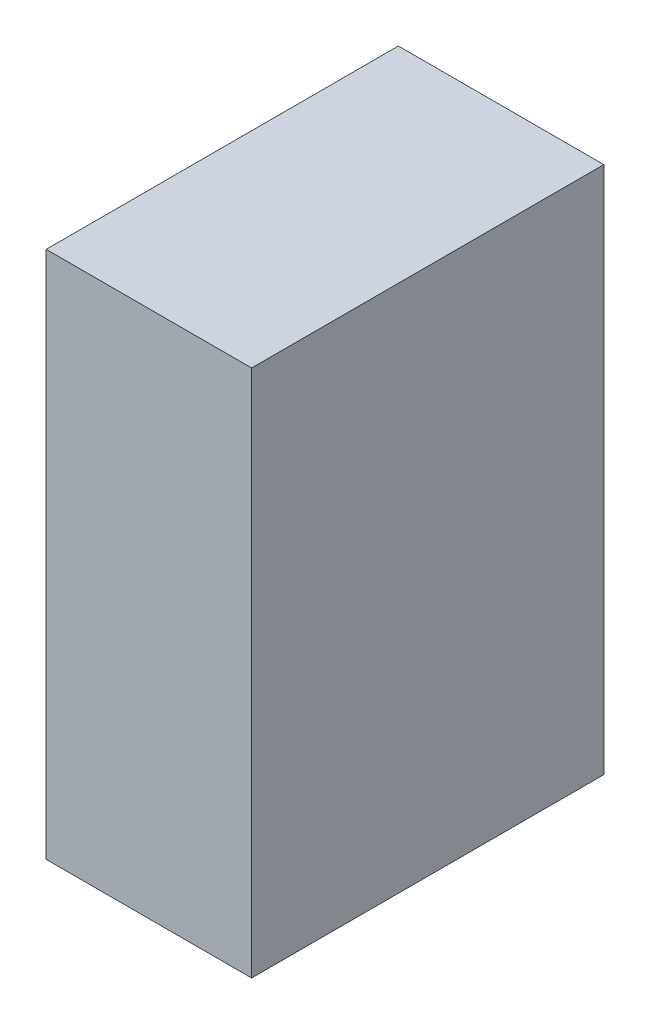
ISO-10303-21;
HEADER;
FILE_DESCRIPTION(('STEP AP214'),'2;1');
FILE_NAME('part.step','',(''),(''),'','','');
FILE_SCHEMA(('AUTOMOTIVE_DESIGN { 1 0 10303 214 1 1 1 1 }'));
ENDSEC;
DATA;
#1=APPLICATION_CONTEXT('core data for automotive mechanical design processes');
#2=APPLICATION_PROTOCOL_DEFINITION('international standard','automotive_design',2000,#1);
#3=PRODUCT_CONTEXT('',#1,'mechanical');
#4=PRODUCT('Part','Part','',(#3));
#5=PRODUCT_RELATED_PRODUCT_CATEGORY('part','',(#4));
#6=PRODUCT_DEFINITION_FORMATION('','',#4);
#7=PRODUCT_DEFINITION_CONTEXT('part definition',#1,'design');
#8=PRODUCT_DEFINITION('design','',#6,#7);
#9=PRODUCT_DEFINITION_SHAPE('','',#8);
#10=(LENGTH_UNIT() NAMED_UNIT(*) SI_UNIT(.MILLI.,.METRE.));
#11=(NAMED_UNIT(*) PLANE_ANGLE_UNIT() SI_UNIT($,.RADIAN.));
#12=(NAMED_UNIT(*) SI_UNIT($,.STERADIAN.) SOLID_ANGLE_UNIT());
#13=UNCERTAINTY_MEASURE_WITH_UNIT(LENGTH_MEASURE(1.E-05),#10,'distance_accuracy_value','');
#14=(GEOMETRIC_REPRESENTATION_CONTEXT(3) GLOBAL_UNCERTAINTY_ASSIGNED_CONTEXT((#13)) GLOBAL_UNIT_ASSIGNED_CONTEXT((#10,
#11,#12)) REPRESENTATION_CONTEXT('',''));
#15=CARTESIAN_POINT('',(0.,0.,0.));
#16=DIRECTION('',(0.,0.,1.));
#17=DIRECTION('',(1.,0.,0.));
#18=AXIS2_PLACEMENT_3D('',#15,#16,#17);
#19=CARTESIAN_POINT('',(-0.17500092,0.4499991,0.5999988));
#20=DIRECTION('',(0.,0.,-1.));
#21=DIRECTION('',(0.,-1.,0.));
#22=AXIS2_PLACEMENT_3D('',#19,#20,#21);
#23=PLANE('',#22);
#24=DIRECTION('',(0.,-1.,0.));
#25=VECTOR('',#24,1.);
#26=CARTESIAN_POINT('',(-0.17500092,0.4499991,0.5999988));
#27=LINE('',#26,#25);
#28=CARTESIAN_POINT('',(-0.17500092,0.4499991,0.5999988));
#29=VERTEX_POINT('',#28);
#30=CARTESIAN_POINT('',(-0.17500092,-0.4499991,0.5999988));
#31=VERTEX_POINT('',#30);
#32=EDGE_CURVE('E82',#29,#31,#27,.T.);
#33=ORIENTED_EDGE('',*,*,#32,.T.);
#34=DIRECTION('',(1.,0.,0.));
#35=VECTOR('',#34,1.);
#36=CARTESIAN_POINT('',(-0.17500092,-0.4499991,0.5999988));
#37=LINE('',#36,#35);
#38=CARTESIAN_POINT('',(0.17499838,-0.4499991,0.5999988));
#39=VERTEX_POINT('',#38);
#40=EDGE_CURVE('E100',#31,#39,#37,.T.);
#41=ORIENTED_EDGE('',*,*,#40,.T.);
#42=DIRECTION('',(0.,1.,0.));
#43=VECTOR('',#42,1.);
#44=CARTESIAN_POINT('',(0.17499838,-0.4499991,0.5999988));
#45=LINE('',#44,#43);
#46=CARTESIAN_POINT('',(0.17499838,0.4499991,0.5999988));
#47=VERTEX_POINT('',#46);
#48=EDGE_CURVE('E74',#39,#47,#45,.T.);
#49=ORIENTED_EDGE('',*,*,#48,.T.);
#50=DIRECTION('',(-1.,0.,0.));
#51=VECTOR('',#50,1.);
#52=CARTESIAN_POINT('',(0.17499838,0.4499991,0.5999988));
#53=LINE('',#52,#51);
#54=EDGE_CURVE('E11',#47,#29,#53,.T.);
#55=ORIENTED_EDGE('',*,*,#54,.T.);
#56=EDGE_LOOP('',(#33,#41,#49,#55));
#57=FACE_BOUND('',#56,.T.);
#58=ADVANCED_FACE('F17',(#57),#23,.F.);
#59=CARTESIAN_POINT('',(-0.17500092,0.4499991,0.));
#60=DIRECTION('',(0.,0.,-1.));
#61=DIRECTION('',(0.,-1.,0.));
#62=AXIS2_PLACEMENT_3D('',#59,#60,#61);
#63=PLANE('',#62);
#64=DIRECTION('',(-1.,0.,0.));
#65=VECTOR('',#64,1.);
#66=CARTESIAN_POINT('',(0.17499838,0.4499991,0.));
#67=LINE('',#66,#65);
#68=CARTESIAN_POINT('',(0.17499838,0.4499991,0.));
#69=VERTEX_POINT('',#68);
#70=CARTESIAN_POINT('',(-0.17500092,0.4499991,0.));
#71=VERTEX_POINT('',#70);
#72=EDGE_CURVE('E26',#69,#71,#67,.T.);
#73=ORIENTED_EDGE('',*,*,#72,.F.);
#74=DIRECTION('',(0.,1.,0.));
#75=VECTOR('',#74,1.);
#76=CARTESIAN_POINT('',(0.17499838,-0.4499991,0.));
#77=LINE('',#76,#75);
#78=CARTESIAN_POINT('',(0.17499838,-0.4499991,0.));
#79=VERTEX_POINT('',#78);
#80=EDGE_CURVE('E20',#79,#69,#77,.T.);
#81=ORIENTED_EDGE('',*,*,#80,.F.);
#82=DIRECTION('',(1.,0.,0.));
#83=VECTOR('',#82,1.);
#84=CARTESIAN_POINT('',(-0.17500092,-0.4499991,0.));
#85=LINE('',#84,#83);
#86=CARTESIAN_POINT('',(-0.17500092,-0.4499991,0.));
#87=VERTEX_POINT('',#86);
#88=EDGE_CURVE('E84',#87,#79,#85,.T.);
#89=ORIENTED_EDGE('',*,*,#88,.F.);
#90=DIRECTION('',(0.,-1.,0.));
#91=VECTOR('',#90,1.);
#92=CARTESIAN_POINT('',(-0.17500092,0.4499991,0.));
#93=LINE('',#92,#91);
#94=EDGE_CURVE('E80',#71,#87,#93,.T.);
#95=ORIENTED_EDGE('',*,*,#94,.F.);
#96=EDGE_LOOP('',(#73,#81,#89,#95));
#97=FACE_BOUND('',#96,.T.);
#98=ADVANCED_FACE('F85',(#97),#63,.T.);
#99=CARTESIAN_POINT('',(0.17499838,0.4499991,0.));
#100=DIRECTION('',(0.,-1.,0.));
#101=DIRECTION('',(0.,0.,-1.));
#102=AXIS2_PLACEMENT_3D('',#99,#100,#101);
#103=PLANE('',#102);
#104=ORIENTED_EDGE('',*,*,#72,.T.);
#105=DIRECTION('',(0.,0.,1.));
#106=VECTOR('',#105,1.);
#107=CARTESIAN_POINT('',(-0.17500092,0.4499991,0.));
#108=LINE('',#107,#106);
#109=EDGE_CURVE('E68',#71,#29,#108,.T.);
#110=ORIENTED_EDGE('',*,*,#109,.T.);
#111=ORIENTED_EDGE('',*,*,#54,.F.);
#112=DIRECTION('',(0.,0.,1.));
#113=VECTOR('',#112,1.);
#114=CARTESIAN_POINT('',(0.17499838,0.4499991,0.));
#115=LINE('',#114,#113);
#116=EDGE_CURVE('E71',#69,#47,#115,.T.);
#117=ORIENTED_EDGE('',*,*,#116,.F.);
#118=EDGE_LOOP('',(#104,#110,#111,#117));
#119=FACE_BOUND('',#118,.T.);
#120=ADVANCED_FACE('F67',(#119),#103,.F.);
#121=CARTESIAN_POINT('',(0.17499838,-0.4499991,0.));
#122=DIRECTION('',(-1.,0.,0.));
#123=DIRECTION('',(0.,0.,1.));
#124=AXIS2_PLACEMENT_3D('',#121,#122,#123);
#125=PLANE('',#124);
#126=ORIENTED_EDGE('',*,*,#80,.T.);
#127=ORIENTED_EDGE('',*,*,#116,.T.);
#128=ORIENTED_EDGE('',*,*,#48,.F.);
#129=DIRECTION('',(0.,0.,1.));
#130=VECTOR('',#129,1.);
#131=CARTESIAN_POINT('',(0.17499838,-0.4499991,0.));
#132=LINE('',#131,#130);
#133=EDGE_CURVE('E96',#79,#39,#132,.T.);
#134=ORIENTED_EDGE('',*,*,#133,.F.);
#135=EDGE_LOOP('',(#126,#127,#128,#134));
#136=FACE_BOUND('',#135,.T.);
#137=ADVANCED_FACE('F124',(#136),#125,.F.);
#138=CARTESIAN_POINT('',(-0.17500092,-0.4499991,0.));
#139=DIRECTION('',(0.,1.,0.));
#140=DIRECTION('',(1.,0.,0.));
#141=AXIS2_PLACEMENT_3D('',#138,#139,#140);
#142=PLANE('',#141);
#143=ORIENTED_EDGE('',*,*,#88,.T.);
#144=ORIENTED_EDGE('',*,*,#133,.T.);
#145=ORIENTED_EDGE('',*,*,#40,.F.);
#146=DIRECTION('',(0.,0.,1.));
#147=VECTOR('',#146,1.);
#148=CARTESIAN_POINT('',(-0.17500092,-0.4499991,0.));
#149=LINE('',#148,#147);
#150=EDGE_CURVE('E89',#87,#31,#149,.T.);
#151=ORIENTED_EDGE('',*,*,#150,.F.);
#152=EDGE_LOOP('',(#143,#144,#145,#151));
#153=FACE_BOUND('',#152,.T.);
#154=ADVANCED_FACE('F120',(#153),#142,.F.);
#155=CARTESIAN_POINT('',(-0.17500092,0.4499991,0.));
#156=DIRECTION('',(1.,0.,0.));
#157=DIRECTION('',(0.,1.,0.));
#158=AXIS2_PLACEMENT_3D('',#155,#156,#157);
#159=PLANE('',#158);
#160=ORIENTED_EDGE('',*,*,#94,.T.);
#161=ORIENTED_EDGE('',*,*,#150,.T.);
#162=ORIENTED_EDGE('',*,*,#32,.F.);
#163=ORIENTED_EDGE('',*,*,#109,.F.);
#164=EDGE_LOOP('',(#160,#161,#162,#163));
#165=FACE_BOUND('',#164,.T.);
#166=ADVANCED_FACE('F78',(#165),#159,.F.);
#167=CLOSED_SHELL('',(#58,#98,#120,#137,#154,#166));
#168=MANIFOLD_SOLID_BREP('B1',#167);
#169=ADVANCED_BREP_SHAPE_REPRESENTATION('',(#18,#168),#14);
#170=SHAPE_DEFINITION_REPRESENTATION(#9,#169);
ENDSEC;
END-ISO-10303-21;
